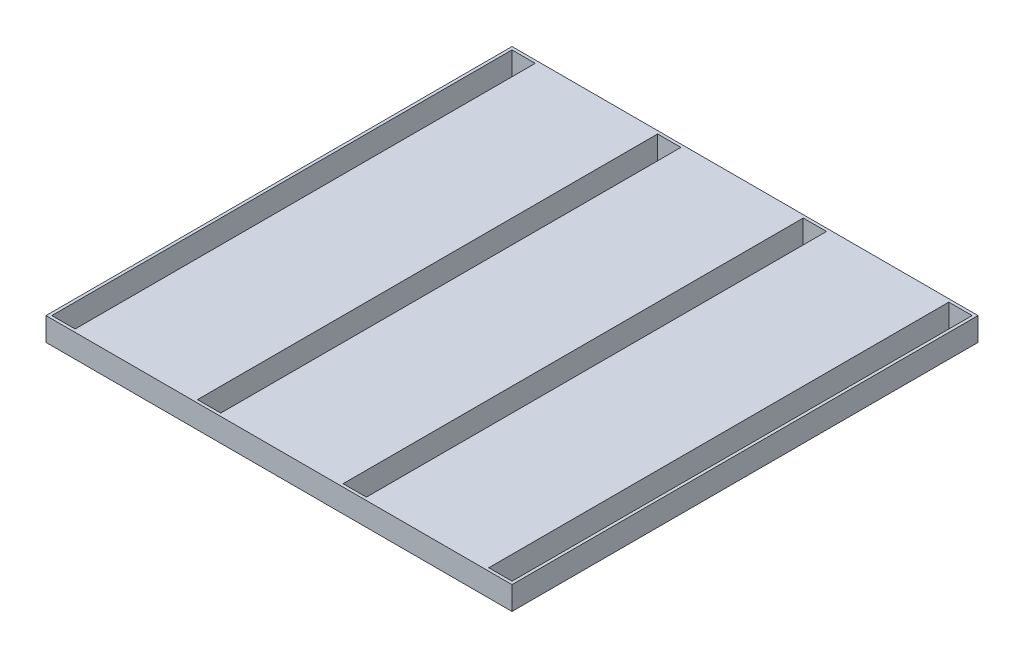
ISO-10303-21;
HEADER;
FILE_DESCRIPTION(('STEP AP214'),'2;1');
FILE_NAME('part.step','',(''),(''),'','','');
FILE_SCHEMA(('AUTOMOTIVE_DESIGN { 1 0 10303 214 1 1 1 1 }'));
ENDSEC;
DATA;
#1=APPLICATION_CONTEXT('core data for automotive mechanical design processes');
#2=APPLICATION_PROTOCOL_DEFINITION('international standard','automotive_design',2000,#1);
#3=PRODUCT_CONTEXT('',#1,'mechanical');
#4=PRODUCT('Part','Part','',(#3));
#5=PRODUCT_RELATED_PRODUCT_CATEGORY('part','',(#4));
#6=PRODUCT_DEFINITION_FORMATION('','',#4);
#7=PRODUCT_DEFINITION_CONTEXT('part definition',#1,'design');
#8=PRODUCT_DEFINITION('design','',#6,#7);
#9=PRODUCT_DEFINITION_SHAPE('','',#8);
#10=(LENGTH_UNIT() NAMED_UNIT(*) SI_UNIT(.MILLI.,.METRE.));
#11=(NAMED_UNIT(*) PLANE_ANGLE_UNIT() SI_UNIT($,.RADIAN.));
#12=(NAMED_UNIT(*) SI_UNIT($,.STERADIAN.) SOLID_ANGLE_UNIT());
#13=UNCERTAINTY_MEASURE_WITH_UNIT(LENGTH_MEASURE(1.E-05),#10,'distance_accuracy_value','');
#14=(GEOMETRIC_REPRESENTATION_CONTEXT(3) GLOBAL_UNCERTAINTY_ASSIGNED_CONTEXT((#13)) GLOBAL_UNIT_ASSIGNED_CONTEXT((#10,
#11,#12)) REPRESENTATION_CONTEXT('',''));
#15=CARTESIAN_POINT('',(0.,0.,0.));
#16=DIRECTION('',(0.,0.,1.));
#17=DIRECTION('',(1.,0.,0.));
#18=AXIS2_PLACEMENT_3D('',#15,#16,#17);
#19=CARTESIAN_POINT('',(0.,2.,0.));
#20=DIRECTION('',(0.,1.,0.));
#21=DIRECTION('',(0.,0.,1.));
#22=AXIS2_PLACEMENT_3D('',#19,#20,#21);
#23=PLANE('',#22);
#24=DIRECTION('',(0.,0.,1.));
#25=VECTOR('',#24,1.);
#26=CARTESIAN_POINT('',(0.,2.,0.));
#27=LINE('',#26,#25);
#28=CARTESIAN_POINT('',(0.,2.,0.));
#29=VERTEX_POINT('',#28);
#30=CARTESIAN_POINT('',(0.,2.,40.));
#31=VERTEX_POINT('',#30);
#32=EDGE_CURVE('E358',#29,#31,#27,.T.);
#33=ORIENTED_EDGE('',*,*,#32,.T.);
#34=DIRECTION('',(1.,0.,0.));
#35=VECTOR('',#34,1.);
#36=CARTESIAN_POINT('',(0.,2.,40.));
#37=LINE('',#36,#35);
#38=CARTESIAN_POINT('',(40.,2.,40.));
#39=VERTEX_POINT('',#38);
#40=EDGE_CURVE('E362',#31,#39,#37,.T.);
#41=ORIENTED_EDGE('',*,*,#40,.T.);
#42=DIRECTION('',(0.,0.,-1.));
#43=VECTOR('',#42,1.);
#44=CARTESIAN_POINT('',(40.,2.,0.));
#45=LINE('',#44,#43);
#46=CARTESIAN_POINT('',(40.,2.,0.));
#47=VERTEX_POINT('',#46);
#48=EDGE_CURVE('E366',#39,#47,#45,.T.);
#49=ORIENTED_EDGE('',*,*,#48,.T.);
#50=DIRECTION('',(-1.,0.,0.));
#51=VECTOR('',#50,1.);
#52=CARTESIAN_POINT('',(0.,2.,0.));
#53=LINE('',#52,#51);
#54=EDGE_CURVE('E369',#47,#29,#53,.T.);
#55=ORIENTED_EDGE('',*,*,#54,.T.);
#56=EDGE_LOOP('',(#33,#41,#49,#55));
#57=FACE_BOUND('',#56,.T.);
#58=DIRECTION('',(1.,0.,0.));
#59=VECTOR('',#58,1.);
#60=CARTESIAN_POINT('',(0.250000000000005,2.,39.75));
#61=LINE('',#60,#59);
#62=CARTESIAN_POINT('',(0.250000000000005,2.,39.75));
#63=VERTEX_POINT('',#62);
#64=CARTESIAN_POINT('',(2.25,2.,39.75));
#65=VERTEX_POINT('',#64);
#66=EDGE_CURVE('E318',#63,#65,#61,.T.);
#67=ORIENTED_EDGE('',*,*,#66,.F.);
#68=DIRECTION('',(0.,0.,1.));
#69=VECTOR('',#68,1.);
#70=CARTESIAN_POINT('',(0.25,2.,0.25));
#71=LINE('',#70,#69);
#72=CARTESIAN_POINT('',(0.25,2.,0.25));
#73=VERTEX_POINT('',#72);
#74=EDGE_CURVE('E315',#73,#63,#71,.T.);
#75=ORIENTED_EDGE('',*,*,#74,.F.);
#76=DIRECTION('',(-1.,0.,0.));
#77=VECTOR('',#76,1.);
#78=CARTESIAN_POINT('',(0.25,2.,0.25));
#79=LINE('',#78,#77);
#80=CARTESIAN_POINT('',(2.25,2.,0.25));
#81=VERTEX_POINT('',#80);
#82=EDGE_CURVE('E326',#81,#73,#79,.T.);
#83=ORIENTED_EDGE('',*,*,#82,.F.);
#84=DIRECTION('',(0.,0.,-1.));
#85=VECTOR('',#84,1.);
#86=CARTESIAN_POINT('',(2.25,2.,0.25));
#87=LINE('',#86,#85);
#88=EDGE_CURVE('E322',#65,#81,#87,.T.);
#89=ORIENTED_EDGE('',*,*,#88,.F.);
#90=EDGE_LOOP('',(#67,#75,#83,#89));
#91=FACE_BOUND('',#90,.T.);
#92=DIRECTION('',(0.,0.,1.));
#93=VECTOR('',#92,1.);
#94=CARTESIAN_POINT('',(12.75,2.,0.25));
#95=LINE('',#94,#93);
#96=CARTESIAN_POINT('',(12.75,2.,0.25));
#97=VERTEX_POINT('',#96);
#98=CARTESIAN_POINT('',(12.75,2.,39.75));
#99=VERTEX_POINT('',#98);
#100=EDGE_CURVE('E275',#97,#99,#95,.T.);
#101=ORIENTED_EDGE('',*,*,#100,.F.);
#102=DIRECTION('',(-1.,0.,0.));
#103=VECTOR('',#102,1.);
#104=CARTESIAN_POINT('',(12.75,2.,0.25));
#105=LINE('',#104,#103);
#106=CARTESIAN_POINT('',(14.75,2.,0.25));
#107=VERTEX_POINT('',#106);
#108=EDGE_CURVE('E272',#107,#97,#105,.T.);
#109=ORIENTED_EDGE('',*,*,#108,.F.);
#110=DIRECTION('',(0.,0.,-1.));
#111=VECTOR('',#110,1.);
#112=CARTESIAN_POINT('',(14.75,2.,0.25));
#113=LINE('',#112,#111);
#114=CARTESIAN_POINT('',(14.75,2.,39.75));
#115=VERTEX_POINT('',#114);
#116=EDGE_CURVE('E283',#115,#107,#113,.T.);
#117=ORIENTED_EDGE('',*,*,#116,.F.);
#118=DIRECTION('',(1.,0.,0.));
#119=VECTOR('',#118,1.);
#120=CARTESIAN_POINT('',(12.75,2.,39.75));
#121=LINE('',#120,#119);
#122=EDGE_CURVE('E279',#99,#115,#121,.T.);
#123=ORIENTED_EDGE('',*,*,#122,.F.);
#124=EDGE_LOOP('',(#101,#109,#117,#123));
#125=FACE_BOUND('',#124,.T.);
#126=DIRECTION('',(0.,0.,1.));
#127=VECTOR('',#126,1.);
#128=CARTESIAN_POINT('',(25.25,2.,0.25));
#129=LINE('',#128,#127);
#130=CARTESIAN_POINT('',(25.25,2.,0.25));
#131=VERTEX_POINT('',#130);
#132=CARTESIAN_POINT('',(25.25,2.,39.75));
#133=VERTEX_POINT('',#132);
#134=EDGE_CURVE('E232',#131,#133,#129,.T.);
#135=ORIENTED_EDGE('',*,*,#134,.F.);
#136=DIRECTION('',(-1.,0.,0.));
#137=VECTOR('',#136,1.);
#138=CARTESIAN_POINT('',(25.25,2.,0.25));
#139=LINE('',#138,#137);
#140=CARTESIAN_POINT('',(27.25,2.,0.25));
#141=VERTEX_POINT('',#140);
#142=EDGE_CURVE('E229',#141,#131,#139,.T.);
#143=ORIENTED_EDGE('',*,*,#142,.F.);
#144=DIRECTION('',(0.,0.,-1.));
#145=VECTOR('',#144,1.);
#146=CARTESIAN_POINT('',(27.25,2.,0.25));
#147=LINE('',#146,#145);
#148=CARTESIAN_POINT('',(27.25,2.,39.75));
#149=VERTEX_POINT('',#148);
#150=EDGE_CURVE('E240',#149,#141,#147,.T.);
#151=ORIENTED_EDGE('',*,*,#150,.F.);
#152=DIRECTION('',(1.,0.,0.));
#153=VECTOR('',#152,1.);
#154=CARTESIAN_POINT('',(25.25,2.,39.75));
#155=LINE('',#154,#153);
#156=EDGE_CURVE('E236',#133,#149,#155,.T.);
#157=ORIENTED_EDGE('',*,*,#156,.F.);
#158=EDGE_LOOP('',(#135,#143,#151,#157));
#159=FACE_BOUND('',#158,.T.);
#160=DIRECTION('',(0.,0.,1.));
#161=VECTOR('',#160,1.);
#162=CARTESIAN_POINT('',(37.75,2.,0.25));
#163=LINE('',#162,#161);
#164=CARTESIAN_POINT('',(37.75,2.,0.25));
#165=VERTEX_POINT('',#164);
#166=CARTESIAN_POINT('',(37.75,2.,39.75));
#167=VERTEX_POINT('',#166);
#168=EDGE_CURVE('E190',#165,#167,#163,.T.);
#169=ORIENTED_EDGE('',*,*,#168,.F.);
#170=DIRECTION('',(-1.,0.,0.));
#171=VECTOR('',#170,1.);
#172=CARTESIAN_POINT('',(37.75,2.,0.25));
#173=LINE('',#172,#171);
#174=CARTESIAN_POINT('',(39.75,2.,0.25));
#175=VERTEX_POINT('',#174);
#176=EDGE_CURVE('E181',#175,#165,#173,.T.);
#177=ORIENTED_EDGE('',*,*,#176,.F.);
#178=DIRECTION('',(0.,0.,-1.));
#179=VECTOR('',#178,1.);
#180=CARTESIAN_POINT('',(39.75,2.,0.25));
#181=LINE('',#180,#179);
#182=CARTESIAN_POINT('',(39.75,2.,39.75));
#183=VERTEX_POINT('',#182);
#184=EDGE_CURVE('E207',#183,#175,#181,.T.);
#185=ORIENTED_EDGE('',*,*,#184,.F.);
#186=DIRECTION('',(1.,0.,0.));
#187=VECTOR('',#186,1.);
#188=CARTESIAN_POINT('',(37.75,2.,39.75));
#189=LINE('',#188,#187);
#190=EDGE_CURVE('E203',#167,#183,#189,.T.);
#191=ORIENTED_EDGE('',*,*,#190,.F.);
#192=EDGE_LOOP('',(#169,#177,#185,#191));
#193=FACE_BOUND('',#192,.T.);
#194=ADVANCED_FACE('F43',(#57,#91,#125,#159,#193),#23,.T.);
#195=CARTESIAN_POINT('',(0.,0.,0.));
#196=DIRECTION('',(0.,1.,0.));
#197=DIRECTION('',(0.,0.,1.));
#198=AXIS2_PLACEMENT_3D('',#195,#196,#197);
#199=PLANE('',#198);
#200=DIRECTION('',(-1.,0.,0.));
#201=VECTOR('',#200,1.);
#202=CARTESIAN_POINT('',(25.25,0.,0.25));
#203=LINE('',#202,#201);
#204=CARTESIAN_POINT('',(27.25,0.,0.25));
#205=VERTEX_POINT('',#204);
#206=CARTESIAN_POINT('',(25.25,0.,0.25));
#207=VERTEX_POINT('',#206);
#208=EDGE_CURVE('E199',#205,#207,#203,.T.);
#209=ORIENTED_EDGE('',*,*,#208,.T.);
#210=DIRECTION('',(0.,0.,1.));
#211=VECTOR('',#210,1.);
#212=CARTESIAN_POINT('',(25.25,0.,0.25));
#213=LINE('',#212,#211);
#214=CARTESIAN_POINT('',(25.25,0.,39.75));
#215=VERTEX_POINT('',#214);
#216=EDGE_CURVE('E247',#207,#215,#213,.T.);
#217=ORIENTED_EDGE('',*,*,#216,.T.);
#218=DIRECTION('',(1.,0.,0.));
#219=VECTOR('',#218,1.);
#220=CARTESIAN_POINT('',(25.25,0.,39.75));
#221=LINE('',#220,#219);
#222=CARTESIAN_POINT('',(27.25,0.,39.75));
#223=VERTEX_POINT('',#222);
#224=EDGE_CURVE('E251',#215,#223,#221,.T.);
#225=ORIENTED_EDGE('',*,*,#224,.T.);
#226=DIRECTION('',(0.,0.,-1.));
#227=VECTOR('',#226,1.);
#228=CARTESIAN_POINT('',(27.25,0.,0.25));
#229=LINE('',#228,#227);
#230=EDGE_CURVE('E233',#223,#205,#229,.T.);
#231=ORIENTED_EDGE('',*,*,#230,.T.);
#232=EDGE_LOOP('',(#209,#217,#225,#231));
#233=FACE_BOUND('',#232,.T.);
#234=DIRECTION('',(0.,0.,1.));
#235=VECTOR('',#234,1.);
#236=CARTESIAN_POINT('',(0.25,0.,0.25));
#237=LINE('',#236,#235);
#238=CARTESIAN_POINT('',(0.25,0.,0.25));
#239=VERTEX_POINT('',#238);
#240=CARTESIAN_POINT('',(0.250000000000005,0.,39.75));
#241=VERTEX_POINT('',#240);
#242=EDGE_CURVE('E314',#239,#241,#237,.T.);
#243=ORIENTED_EDGE('',*,*,#242,.T.);
#244=DIRECTION('',(1.,0.,0.));
#245=VECTOR('',#244,1.);
#246=CARTESIAN_POINT('',(0.250000000000005,0.,39.75));
#247=LINE('',#246,#245);
#248=CARTESIAN_POINT('',(2.25,0.,39.75));
#249=VERTEX_POINT('',#248);
#250=EDGE_CURVE('E333',#241,#249,#247,.T.);
#251=ORIENTED_EDGE('',*,*,#250,.T.);
#252=DIRECTION('',(0.,0.,-1.));
#253=VECTOR('',#252,1.);
#254=CARTESIAN_POINT('',(2.25,0.,0.25));
#255=LINE('',#254,#253);
#256=CARTESIAN_POINT('',(2.25,0.,0.25));
#257=VERTEX_POINT('',#256);
#258=EDGE_CURVE('E337',#249,#257,#255,.T.);
#259=ORIENTED_EDGE('',*,*,#258,.T.);
#260=DIRECTION('',(-1.,0.,0.));
#261=VECTOR('',#260,1.);
#262=CARTESIAN_POINT('',(0.25,0.,0.25));
#263=LINE('',#262,#261);
#264=EDGE_CURVE('E319',#257,#239,#263,.T.);
#265=ORIENTED_EDGE('',*,*,#264,.T.);
#266=EDGE_LOOP('',(#243,#251,#259,#265));
#267=FACE_BOUND('',#266,.T.);
#268=DIRECTION('',(0.,0.,1.));
#269=VECTOR('',#268,1.);
#270=CARTESIAN_POINT('',(0.,0.,0.));
#271=LINE('',#270,#269);
#272=CARTESIAN_POINT('',(0.,0.,0.));
#273=VERTEX_POINT('',#272);
#274=CARTESIAN_POINT('',(0.,0.,40.));
#275=VERTEX_POINT('',#274);
#276=EDGE_CURVE('E357',#273,#275,#271,.T.);
#277=ORIENTED_EDGE('',*,*,#276,.F.);
#278=DIRECTION('',(-1.,0.,0.));
#279=VECTOR('',#278,1.);
#280=CARTESIAN_POINT('',(0.,0.,0.));
#281=LINE('',#280,#279);
#282=CARTESIAN_POINT('',(40.,0.,0.));
#283=VERTEX_POINT('',#282);
#284=EDGE_CURVE('E363',#283,#273,#281,.T.);
#285=ORIENTED_EDGE('',*,*,#284,.F.);
#286=DIRECTION('',(0.,0.,-1.));
#287=VECTOR('',#286,1.);
#288=CARTESIAN_POINT('',(40.,0.,0.));
#289=LINE('',#288,#287);
#290=CARTESIAN_POINT('',(40.,0.,40.));
#291=VERTEX_POINT('',#290);
#292=EDGE_CURVE('E379',#291,#283,#289,.T.);
#293=ORIENTED_EDGE('',*,*,#292,.F.);
#294=DIRECTION('',(1.,0.,0.));
#295=VECTOR('',#294,1.);
#296=CARTESIAN_POINT('',(0.,0.,40.));
#297=LINE('',#296,#295);
#298=EDGE_CURVE('E376',#275,#291,#297,.T.);
#299=ORIENTED_EDGE('',*,*,#298,.F.);
#300=EDGE_LOOP('',(#277,#285,#293,#299));
#301=FACE_BOUND('',#300,.T.);
#302=DIRECTION('',(-1.,0.,0.));
#303=VECTOR('',#302,1.);
#304=CARTESIAN_POINT('',(12.75,0.,0.25));
#305=LINE('',#304,#303);
#306=CARTESIAN_POINT('',(14.75,0.,0.25));
#307=VERTEX_POINT('',#306);
#308=CARTESIAN_POINT('',(12.75,0.,0.25));
#309=VERTEX_POINT('',#308);
#310=EDGE_CURVE('E271',#307,#309,#305,.T.);
#311=ORIENTED_EDGE('',*,*,#310,.T.);
#312=DIRECTION('',(0.,0.,1.));
#313=VECTOR('',#312,1.);
#314=CARTESIAN_POINT('',(12.75,0.,0.25));
#315=LINE('',#314,#313);
#316=CARTESIAN_POINT('',(12.75,0.,39.75));
#317=VERTEX_POINT('',#316);
#318=EDGE_CURVE('E290',#309,#317,#315,.T.);
#319=ORIENTED_EDGE('',*,*,#318,.T.);
#320=DIRECTION('',(1.,0.,0.));
#321=VECTOR('',#320,1.);
#322=CARTESIAN_POINT('',(12.75,0.,39.75));
#323=LINE('',#322,#321);
#324=CARTESIAN_POINT('',(14.75,0.,39.75));
#325=VERTEX_POINT('',#324);
#326=EDGE_CURVE('E294',#317,#325,#323,.T.);
#327=ORIENTED_EDGE('',*,*,#326,.T.);
#328=DIRECTION('',(0.,0.,-1.));
#329=VECTOR('',#328,1.);
#330=CARTESIAN_POINT('',(14.75,0.,0.25));
#331=LINE('',#330,#329);
#332=EDGE_CURVE('E276',#325,#307,#331,.T.);
#333=ORIENTED_EDGE('',*,*,#332,.T.);
#334=EDGE_LOOP('',(#311,#319,#327,#333));
#335=FACE_BOUND('',#334,.T.);
#336=DIRECTION('',(-1.,0.,0.));
#337=VECTOR('',#336,1.);
#338=CARTESIAN_POINT('',(37.75,0.,0.25));
#339=LINE('',#338,#337);
#340=CARTESIAN_POINT('',(39.75,0.,0.25));
#341=VERTEX_POINT('',#340);
#342=CARTESIAN_POINT('',(37.75,0.,0.25));
#343=VERTEX_POINT('',#342);
#344=EDGE_CURVE('E67',#341,#343,#339,.T.);
#345=ORIENTED_EDGE('',*,*,#344,.T.);
#346=DIRECTION('',(0.,0.,1.));
#347=VECTOR('',#346,1.);
#348=CARTESIAN_POINT('',(37.75,0.,0.25));
#349=LINE('',#348,#347);
#350=CARTESIAN_POINT('',(37.75,0.,39.75));
#351=VERTEX_POINT('',#350);
#352=EDGE_CURVE('E197',#343,#351,#349,.T.);
#353=ORIENTED_EDGE('',*,*,#352,.T.);
#354=DIRECTION('',(1.,0.,0.));
#355=VECTOR('',#354,1.);
#356=CARTESIAN_POINT('',(37.75,0.,39.75));
#357=LINE('',#356,#355);
#358=CARTESIAN_POINT('',(39.75,0.,39.75));
#359=VERTEX_POINT('',#358);
#360=EDGE_CURVE('E216',#351,#359,#357,.T.);
#361=ORIENTED_EDGE('',*,*,#360,.T.);
#362=DIRECTION('',(0.,0.,-1.));
#363=VECTOR('',#362,1.);
#364=CARTESIAN_POINT('',(39.75,0.,0.25));
#365=LINE('',#364,#363);
#366=EDGE_CURVE('E191',#359,#341,#365,.T.);
#367=ORIENTED_EDGE('',*,*,#366,.T.);
#368=EDGE_LOOP('',(#345,#353,#361,#367));
#369=FACE_BOUND('',#368,.T.);
#370=ADVANCED_FACE('F402',(#233,#267,#301,#335,#369),#199,.F.);
#371=CARTESIAN_POINT('',(0.,2.,0.));
#372=DIRECTION('',(1.,0.,0.));
#373=DIRECTION('',(0.,0.,-1.));
#374=AXIS2_PLACEMENT_3D('',#371,#372,#373);
#375=PLANE('',#374);
#376=ORIENTED_EDGE('',*,*,#276,.T.);
#377=DIRECTION('',(0.,-1.,0.));
#378=VECTOR('',#377,1.);
#379=CARTESIAN_POINT('',(0.,2.,40.));
#380=LINE('',#379,#378);
#381=EDGE_CURVE('E11',#31,#275,#380,.T.);
#382=ORIENTED_EDGE('',*,*,#381,.F.);
#383=ORIENTED_EDGE('',*,*,#32,.F.);
#384=DIRECTION('',(0.,-1.,0.));
#385=VECTOR('',#384,1.);
#386=CARTESIAN_POINT('',(0.,2.,0.));
#387=LINE('',#386,#385);
#388=EDGE_CURVE('E372',#29,#273,#387,.T.);
#389=ORIENTED_EDGE('',*,*,#388,.T.);
#390=EDGE_LOOP('',(#376,#382,#383,#389));
#391=FACE_BOUND('',#390,.T.);
#392=ADVANCED_FACE('F45',(#391),#375,.F.);
#393=CARTESIAN_POINT('',(0.,2.,40.));
#394=DIRECTION('',(0.,0.,-1.));
#395=DIRECTION('',(-1.,0.,0.));
#396=AXIS2_PLACEMENT_3D('',#393,#394,#395);
#397=PLANE('',#396);
#398=ORIENTED_EDGE('',*,*,#298,.T.);
#399=DIRECTION('',(0.,-1.,0.));
#400=VECTOR('',#399,1.);
#401=CARTESIAN_POINT('',(40.,2.,40.));
#402=LINE('',#401,#400);
#403=EDGE_CURVE('E52',#39,#291,#402,.T.);
#404=ORIENTED_EDGE('',*,*,#403,.F.);
#405=ORIENTED_EDGE('',*,*,#40,.F.);
#406=ORIENTED_EDGE('',*,*,#381,.T.);
#407=EDGE_LOOP('',(#398,#404,#405,#406));
#408=FACE_BOUND('',#407,.T.);
#409=ADVANCED_FACE('F413',(#408),#397,.F.);
#410=CARTESIAN_POINT('',(40.,2.,0.));
#411=DIRECTION('',(-1.,0.,0.));
#412=DIRECTION('',(0.,0.,1.));
#413=AXIS2_PLACEMENT_3D('',#410,#411,#412);
#414=PLANE('',#413);
#415=ORIENTED_EDGE('',*,*,#292,.T.);
#416=DIRECTION('',(0.,-1.,0.));
#417=VECTOR('',#416,1.);
#418=CARTESIAN_POINT('',(40.,2.,0.));
#419=LINE('',#418,#417);
#420=EDGE_CURVE('E387',#47,#283,#419,.T.);
#421=ORIENTED_EDGE('',*,*,#420,.F.);
#422=ORIENTED_EDGE('',*,*,#48,.F.);
#423=ORIENTED_EDGE('',*,*,#403,.T.);
#424=EDGE_LOOP('',(#415,#421,#422,#423));
#425=FACE_BOUND('',#424,.T.);
#426=ADVANCED_FACE('F396',(#425),#414,.F.);
#427=CARTESIAN_POINT('',(0.,2.,0.));
#428=DIRECTION('',(0.,0.,1.));
#429=DIRECTION('',(1.,0.,0.));
#430=AXIS2_PLACEMENT_3D('',#427,#428,#429);
#431=PLANE('',#430);
#432=ORIENTED_EDGE('',*,*,#284,.T.);
#433=ORIENTED_EDGE('',*,*,#388,.F.);
#434=ORIENTED_EDGE('',*,*,#54,.F.);
#435=ORIENTED_EDGE('',*,*,#420,.T.);
#436=EDGE_LOOP('',(#432,#433,#434,#435));
#437=FACE_BOUND('',#436,.T.);
#438=ADVANCED_FACE('F406',(#437),#431,.F.);
#439=CARTESIAN_POINT('',(0.25,2.,0.25));
#440=DIRECTION('',(1.,0.,0.));
#441=DIRECTION('',(0.,0.,-1.));
#442=AXIS2_PLACEMENT_3D('',#439,#440,#441);
#443=PLANE('',#442);
#444=ORIENTED_EDGE('',*,*,#242,.F.);
#445=DIRECTION('',(0.,-1.,0.));
#446=VECTOR('',#445,1.);
#447=CARTESIAN_POINT('',(0.25,2.,0.25));
#448=LINE('',#447,#446);
#449=EDGE_CURVE('E329',#73,#239,#448,.T.);
#450=ORIENTED_EDGE('',*,*,#449,.F.);
#451=ORIENTED_EDGE('',*,*,#74,.T.);
#452=DIRECTION('',(0.,-1.,0.));
#453=VECTOR('',#452,1.);
#454=CARTESIAN_POINT('',(0.250000000000005,2.,39.75));
#455=LINE('',#454,#453);
#456=EDGE_CURVE('E353',#63,#241,#455,.T.);
#457=ORIENTED_EDGE('',*,*,#456,.T.);
#458=EDGE_LOOP('',(#444,#450,#451,#457));
#459=FACE_BOUND('',#458,.T.);
#460=ADVANCED_FACE('F428',(#459),#443,.T.);
#461=CARTESIAN_POINT('',(0.250000000000005,2.,39.75));
#462=DIRECTION('',(0.,0.,-1.));
#463=DIRECTION('',(-1.,0.,0.));
#464=AXIS2_PLACEMENT_3D('',#461,#462,#463);
#465=PLANE('',#464);
#466=ORIENTED_EDGE('',*,*,#250,.F.);
#467=ORIENTED_EDGE('',*,*,#456,.F.);
#468=ORIENTED_EDGE('',*,*,#66,.T.);
#469=DIRECTION('',(0.,-1.,0.));
#470=VECTOR('',#469,1.);
#471=CARTESIAN_POINT('',(2.25,2.,39.75));
#472=LINE('',#471,#470);
#473=EDGE_CURVE('E350',#65,#249,#472,.T.);
#474=ORIENTED_EDGE('',*,*,#473,.T.);
#475=EDGE_LOOP('',(#466,#467,#468,#474));
#476=FACE_BOUND('',#475,.T.);
#477=ADVANCED_FACE('F435',(#476),#465,.T.);
#478=CARTESIAN_POINT('',(2.25,2.,0.25));
#479=DIRECTION('',(-1.,0.,0.));
#480=DIRECTION('',(0.,0.,1.));
#481=AXIS2_PLACEMENT_3D('',#478,#479,#480);
#482=PLANE('',#481);
#483=ORIENTED_EDGE('',*,*,#258,.F.);
#484=ORIENTED_EDGE('',*,*,#473,.F.);
#485=ORIENTED_EDGE('',*,*,#88,.T.);
#486=DIRECTION('',(0.,-1.,0.));
#487=VECTOR('',#486,1.);
#488=CARTESIAN_POINT('',(2.25,2.,0.25));
#489=LINE('',#488,#487);
#490=EDGE_CURVE('E347',#81,#257,#489,.T.);
#491=ORIENTED_EDGE('',*,*,#490,.T.);
#492=EDGE_LOOP('',(#483,#484,#485,#491));
#493=FACE_BOUND('',#492,.T.);
#494=ADVANCED_FACE('F440',(#493),#482,.T.);
#495=CARTESIAN_POINT('',(0.25,2.,0.25));
#496=DIRECTION('',(0.,0.,1.));
#497=DIRECTION('',(1.,0.,0.));
#498=AXIS2_PLACEMENT_3D('',#495,#496,#497);
#499=PLANE('',#498);
#500=ORIENTED_EDGE('',*,*,#264,.F.);
#501=ORIENTED_EDGE('',*,*,#490,.F.);
#502=ORIENTED_EDGE('',*,*,#82,.T.);
#503=ORIENTED_EDGE('',*,*,#449,.T.);
#504=EDGE_LOOP('',(#500,#501,#502,#503));
#505=FACE_BOUND('',#504,.T.);
#506=ADVANCED_FACE('F448',(#505),#499,.T.);
#507=CARTESIAN_POINT('',(12.75,2.,0.25));
#508=DIRECTION('',(0.,0.,1.));
#509=DIRECTION('',(1.,0.,0.));
#510=AXIS2_PLACEMENT_3D('',#507,#508,#509);
#511=PLANE('',#510);
#512=ORIENTED_EDGE('',*,*,#310,.F.);
#513=DIRECTION('',(0.,-1.,0.));
#514=VECTOR('',#513,1.);
#515=CARTESIAN_POINT('',(14.75,2.,0.25));
#516=LINE('',#515,#514);
#517=EDGE_CURVE('E286',#107,#307,#516,.T.);
#518=ORIENTED_EDGE('',*,*,#517,.F.);
#519=ORIENTED_EDGE('',*,*,#108,.T.);
#520=DIRECTION('',(0.,-1.,0.));
#521=VECTOR('',#520,1.);
#522=CARTESIAN_POINT('',(12.75,2.,0.25));
#523=LINE('',#522,#521);
#524=EDGE_CURVE('E310',#97,#309,#523,.T.);
#525=ORIENTED_EDGE('',*,*,#524,.T.);
#526=EDGE_LOOP('',(#512,#518,#519,#525));
#527=FACE_BOUND('',#526,.T.);
#528=ADVANCED_FACE('F502',(#527),#511,.T.);
#529=CARTESIAN_POINT('',(12.75,2.,0.25));
#530=DIRECTION('',(1.,0.,0.));
#531=DIRECTION('',(0.,0.,-1.));
#532=AXIS2_PLACEMENT_3D('',#529,#530,#531);
#533=PLANE('',#532);
#534=ORIENTED_EDGE('',*,*,#318,.F.);
#535=ORIENTED_EDGE('',*,*,#524,.F.);
#536=ORIENTED_EDGE('',*,*,#100,.T.);
#537=DIRECTION('',(0.,-1.,0.));
#538=VECTOR('',#537,1.);
#539=CARTESIAN_POINT('',(12.75,2.,39.75));
#540=LINE('',#539,#538);
#541=EDGE_CURVE('E307',#99,#317,#540,.T.);
#542=ORIENTED_EDGE('',*,*,#541,.T.);
#543=EDGE_LOOP('',(#534,#535,#536,#542));
#544=FACE_BOUND('',#543,.T.);
#545=ADVANCED_FACE('F498',(#544),#533,.T.);
#546=CARTESIAN_POINT('',(12.75,2.,39.75));
#547=DIRECTION('',(0.,0.,-1.));
#548=DIRECTION('',(-1.,0.,0.));
#549=AXIS2_PLACEMENT_3D('',#546,#547,#548);
#550=PLANE('',#549);
#551=ORIENTED_EDGE('',*,*,#326,.F.);
#552=ORIENTED_EDGE('',*,*,#541,.F.);
#553=ORIENTED_EDGE('',*,*,#122,.T.);
#554=DIRECTION('',(0.,-1.,0.));
#555=VECTOR('',#554,1.);
#556=CARTESIAN_POINT('',(14.75,2.,39.75));
#557=LINE('',#556,#555);
#558=EDGE_CURVE('E304',#115,#325,#557,.T.);
#559=ORIENTED_EDGE('',*,*,#558,.T.);
#560=EDGE_LOOP('',(#551,#552,#553,#559));
#561=FACE_BOUND('',#560,.T.);
#562=ADVANCED_FACE('F494',(#561),#550,.T.);
#563=CARTESIAN_POINT('',(14.75,2.,0.25));
#564=DIRECTION('',(-1.,0.,0.));
#565=DIRECTION('',(0.,0.,1.));
#566=AXIS2_PLACEMENT_3D('',#563,#564,#565);
#567=PLANE('',#566);
#568=ORIENTED_EDGE('',*,*,#332,.F.);
#569=ORIENTED_EDGE('',*,*,#558,.F.);
#570=ORIENTED_EDGE('',*,*,#116,.T.);
#571=ORIENTED_EDGE('',*,*,#517,.T.);
#572=EDGE_LOOP('',(#568,#569,#570,#571));
#573=FACE_BOUND('',#572,.T.);
#574=ADVANCED_FACE('F491',(#573),#567,.T.);
#575=CARTESIAN_POINT('',(25.25,2.,0.25));
#576=DIRECTION('',(0.,0.,1.));
#577=DIRECTION('',(1.,0.,0.));
#578=AXIS2_PLACEMENT_3D('',#575,#576,#577);
#579=PLANE('',#578);
#580=ORIENTED_EDGE('',*,*,#208,.F.);
#581=DIRECTION('',(0.,-1.,0.));
#582=VECTOR('',#581,1.);
#583=CARTESIAN_POINT('',(27.25,2.,0.25));
#584=LINE('',#583,#582);
#585=EDGE_CURVE('E243',#141,#205,#584,.T.);
#586=ORIENTED_EDGE('',*,*,#585,.F.);
#587=ORIENTED_EDGE('',*,*,#142,.T.);
#588=DIRECTION('',(0.,-1.,0.));
#589=VECTOR('',#588,1.);
#590=CARTESIAN_POINT('',(25.25,2.,0.25));
#591=LINE('',#590,#589);
#592=EDGE_CURVE('E267',#131,#207,#591,.T.);
#593=ORIENTED_EDGE('',*,*,#592,.T.);
#594=EDGE_LOOP('',(#580,#586,#587,#593));
#595=FACE_BOUND('',#594,.T.);
#596=ADVANCED_FACE('F473',(#595),#579,.T.);
#597=CARTESIAN_POINT('',(25.25,2.,0.25));
#598=DIRECTION('',(1.,0.,0.));
#599=DIRECTION('',(0.,0.,-1.));
#600=AXIS2_PLACEMENT_3D('',#597,#598,#599);
#601=PLANE('',#600);
#602=ORIENTED_EDGE('',*,*,#216,.F.);
#603=ORIENTED_EDGE('',*,*,#592,.F.);
#604=ORIENTED_EDGE('',*,*,#134,.T.);
#605=DIRECTION('',(0.,-1.,0.));
#606=VECTOR('',#605,1.);
#607=CARTESIAN_POINT('',(25.25,2.,39.75));
#608=LINE('',#607,#606);
#609=EDGE_CURVE('E264',#133,#215,#608,.T.);
#610=ORIENTED_EDGE('',*,*,#609,.T.);
#611=EDGE_LOOP('',(#602,#603,#604,#610));
#612=FACE_BOUND('',#611,.T.);
#613=ADVANCED_FACE('F467',(#612),#601,.T.);
#614=CARTESIAN_POINT('',(25.25,2.,39.75));
#615=DIRECTION('',(0.,0.,-1.));
#616=DIRECTION('',(-1.,0.,0.));
#617=AXIS2_PLACEMENT_3D('',#614,#615,#616);
#618=PLANE('',#617);
#619=ORIENTED_EDGE('',*,*,#224,.F.);
#620=ORIENTED_EDGE('',*,*,#609,.F.);
#621=ORIENTED_EDGE('',*,*,#156,.T.);
#622=DIRECTION('',(0.,-1.,0.));
#623=VECTOR('',#622,1.);
#624=CARTESIAN_POINT('',(27.25,2.,39.75));
#625=LINE('',#624,#623);
#626=EDGE_CURVE('E261',#149,#223,#625,.T.);
#627=ORIENTED_EDGE('',*,*,#626,.T.);
#628=EDGE_LOOP('',(#619,#620,#621,#627));
#629=FACE_BOUND('',#628,.T.);
#630=ADVANCED_FACE('F470',(#629),#618,.T.);
#631=CARTESIAN_POINT('',(27.25,2.,0.25));
#632=DIRECTION('',(-1.,0.,0.));
#633=DIRECTION('',(0.,0.,1.));
#634=AXIS2_PLACEMENT_3D('',#631,#632,#633);
#635=PLANE('',#634);
#636=ORIENTED_EDGE('',*,*,#230,.F.);
#637=ORIENTED_EDGE('',*,*,#626,.F.);
#638=ORIENTED_EDGE('',*,*,#150,.T.);
#639=ORIENTED_EDGE('',*,*,#585,.T.);
#640=EDGE_LOOP('',(#636,#637,#638,#639));
#641=FACE_BOUND('',#640,.T.);
#642=ADVANCED_FACE('F476',(#641),#635,.T.);
#643=CARTESIAN_POINT('',(37.75,2.,0.25));
#644=DIRECTION('',(0.,0.,1.));
#645=DIRECTION('',(1.,0.,0.));
#646=AXIS2_PLACEMENT_3D('',#643,#644,#645);
#647=PLANE('',#646);
#648=ORIENTED_EDGE('',*,*,#344,.F.);
#649=DIRECTION('',(0.,-1.,0.));
#650=VECTOR('',#649,1.);
#651=CARTESIAN_POINT('',(39.75,2.,0.25));
#652=LINE('',#651,#650);
#653=EDGE_CURVE('E185',#175,#341,#652,.T.);
#654=ORIENTED_EDGE('',*,*,#653,.F.);
#655=ORIENTED_EDGE('',*,*,#176,.T.);
#656=DIRECTION('',(0.,-1.,0.));
#657=VECTOR('',#656,1.);
#658=CARTESIAN_POINT('',(37.75,2.,0.25));
#659=LINE('',#658,#657);
#660=EDGE_CURVE('E184',#165,#343,#659,.T.);
#661=ORIENTED_EDGE('',*,*,#660,.T.);
#662=EDGE_LOOP('',(#648,#654,#655,#661));
#663=FACE_BOUND('',#662,.T.);
#664=ADVANCED_FACE('F183',(#663),#647,.T.);
#665=CARTESIAN_POINT('',(37.75,2.,0.25));
#666=DIRECTION('',(1.,0.,0.));
#667=DIRECTION('',(0.,0.,-1.));
#668=AXIS2_PLACEMENT_3D('',#665,#666,#667);
#669=PLANE('',#668);
#670=ORIENTED_EDGE('',*,*,#352,.F.);
#671=ORIENTED_EDGE('',*,*,#660,.F.);
#672=ORIENTED_EDGE('',*,*,#168,.T.);
#673=DIRECTION('',(0.,-1.,0.));
#674=VECTOR('',#673,1.);
#675=CARTESIAN_POINT('',(37.75,2.,39.75));
#676=LINE('',#675,#674);
#677=EDGE_CURVE('E200',#167,#351,#676,.T.);
#678=ORIENTED_EDGE('',*,*,#677,.T.);
#679=EDGE_LOOP('',(#670,#671,#672,#678));
#680=FACE_BOUND('',#679,.T.);
#681=ADVANCED_FACE('F194',(#680),#669,.T.);
#682=CARTESIAN_POINT('',(37.75,2.,39.75));
#683=DIRECTION('',(0.,0.,-1.));
#684=DIRECTION('',(-1.,0.,0.));
#685=AXIS2_PLACEMENT_3D('',#682,#683,#684);
#686=PLANE('',#685);
#687=ORIENTED_EDGE('',*,*,#360,.F.);
#688=ORIENTED_EDGE('',*,*,#677,.F.);
#689=ORIENTED_EDGE('',*,*,#190,.T.);
#690=DIRECTION('',(0.,-1.,0.));
#691=VECTOR('',#690,1.);
#692=CARTESIAN_POINT('',(39.75,2.,39.75));
#693=LINE('',#692,#691);
#694=EDGE_CURVE('E59',#183,#359,#693,.T.);
#695=ORIENTED_EDGE('',*,*,#694,.T.);
#696=EDGE_LOOP('',(#687,#688,#689,#695));
#697=FACE_BOUND('',#696,.T.);
#698=ADVANCED_FACE('F568',(#697),#686,.T.);
#699=CARTESIAN_POINT('',(39.75,2.,0.25));
#700=DIRECTION('',(-1.,0.,0.));
#701=DIRECTION('',(0.,0.,1.));
#702=AXIS2_PLACEMENT_3D('',#699,#700,#701);
#703=PLANE('',#702);
#704=ORIENTED_EDGE('',*,*,#366,.F.);
#705=ORIENTED_EDGE('',*,*,#694,.F.);
#706=ORIENTED_EDGE('',*,*,#184,.T.);
#707=ORIENTED_EDGE('',*,*,#653,.T.);
#708=EDGE_LOOP('',(#704,#705,#706,#707));
#709=FACE_BOUND('',#708,.T.);
#710=ADVANCED_FACE('F577',(#709),#703,.T.);
#711=CLOSED_SHELL('',(#194,#370,#392,#409,#426,#438,#460,#477,#494,#506,#528,#545,#562,#574,
#596,#613,#630,#642,#664,#681,#698,#710));
#712=MANIFOLD_SOLID_BREP('B2',#711);
#713=ADVANCED_BREP_SHAPE_REPRESENTATION('',(#18,#712),#14);
#714=SHAPE_DEFINITION_REPRESENTATION(#9,#713);
ENDSEC;
END-ISO-10303-21;
